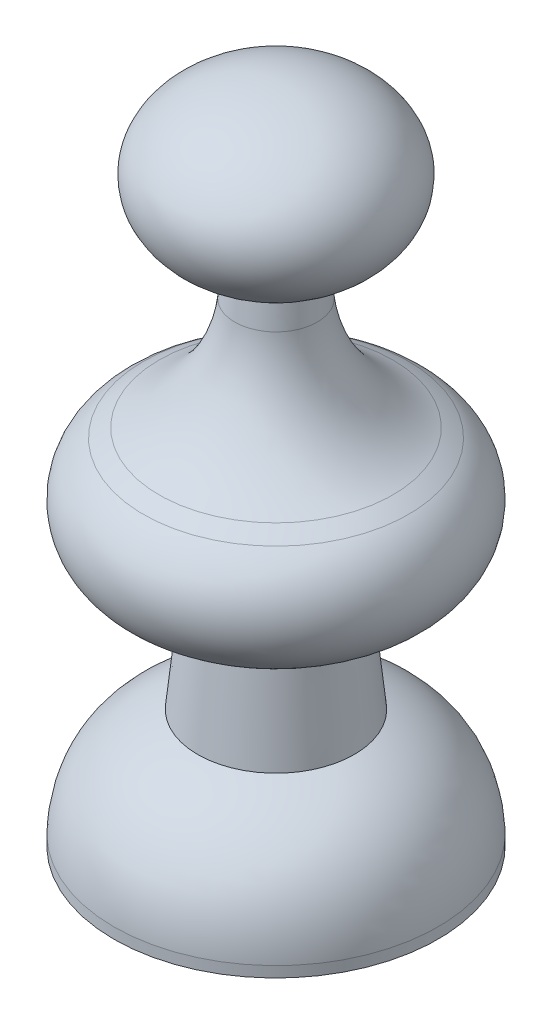
ISO-10303-21;
HEADER;
FILE_DESCRIPTION(('STEP AP214'),'2;1');
FILE_NAME('part.step','',(''),(''),'','','');
FILE_SCHEMA(('AUTOMOTIVE_DESIGN { 1 0 10303 214 1 1 1 1 }'));
ENDSEC;
DATA;
#1=APPLICATION_CONTEXT('core data for automotive mechanical design processes');
#2=APPLICATION_PROTOCOL_DEFINITION('international standard','automotive_design',2000,#1);
#3=PRODUCT_CONTEXT('',#1,'mechanical');
#4=PRODUCT('Part','Part','',(#3));
#5=PRODUCT_RELATED_PRODUCT_CATEGORY('part','',(#4));
#6=PRODUCT_DEFINITION_FORMATION('','',#4);
#7=PRODUCT_DEFINITION_CONTEXT('part definition',#1,'design');
#8=PRODUCT_DEFINITION('design','',#6,#7);
#9=PRODUCT_DEFINITION_SHAPE('','',#8);
#10=(LENGTH_UNIT() NAMED_UNIT(*) SI_UNIT(.MILLI.,.METRE.));
#11=(NAMED_UNIT(*) PLANE_ANGLE_UNIT() SI_UNIT($,.RADIAN.));
#12=(NAMED_UNIT(*) SI_UNIT($,.STERADIAN.) SOLID_ANGLE_UNIT());
#13=UNCERTAINTY_MEASURE_WITH_UNIT(LENGTH_MEASURE(1.E-05),#10,'distance_accuracy_value','');
#14=(GEOMETRIC_REPRESENTATION_CONTEXT(3) GLOBAL_UNCERTAINTY_ASSIGNED_CONTEXT((#13)) GLOBAL_UNIT_ASSIGNED_CONTEXT((#10,
#11,#12)) REPRESENTATION_CONTEXT('',''));
#15=CARTESIAN_POINT('',(0.,0.,0.));
#16=DIRECTION('',(0.,0.,1.));
#17=DIRECTION('',(1.,0.,0.));
#18=AXIS2_PLACEMENT_3D('',#15,#16,#17);
#19=CARTESIAN_POINT('',(0.,-0.762,0.));
#20=DIRECTION('',(0.,1.,0.));
#21=DIRECTION('',(0.,0.,1.));
#22=AXIS2_PLACEMENT_3D('',#19,#20,#21);
#23=CYLINDRICAL_SURFACE('',#22,11.5);
#24=CARTESIAN_POINT('',(0.,-0.762,0.));
#25=DIRECTION('',(0.,-1.,0.));
#26=DIRECTION('',(0.,0.,-1.));
#27=AXIS2_PLACEMENT_3D('',#24,#25,#26);
#28=CIRCLE('',#27,11.5);
#29=CARTESIAN_POINT('',(0.,-0.762,11.5));
#30=VERTEX_POINT('',#29);
#31=EDGE_CURVE('E11',#30,#30,#28,.T.);
#32=CARTESIAN_POINT('',(0.,0.,0.));
#33=DIRECTION('',(0.,-1.,0.));
#34=DIRECTION('',(0.,0.,-1.));
#35=AXIS2_PLACEMENT_3D('',#32,#33,#34);
#36=CIRCLE('',#35,11.5);
#37=CARTESIAN_POINT('',(0.,0.,11.5));
#38=VERTEX_POINT('',#37);
#39=EDGE_CURVE('E43',#38,#38,#36,.T.);
#40=CARTESIAN_POINT('',(0.,-0.762,11.5));
#41=CARTESIAN_POINT('',(0.,-0.7540625,11.5));
#42=CARTESIAN_POINT('',(0.,-0.746125,11.5));
#43=CARTESIAN_POINT('',(0.,-0.73025,11.5));
#44=CARTESIAN_POINT('',(0.,-0.7223125,11.5));
#45=CARTESIAN_POINT('',(0.,-0.7064375,11.5));
#46=CARTESIAN_POINT('',(0.,-0.6985,11.5));
#47=CARTESIAN_POINT('',(0.,-0.682625,11.5));
#48=CARTESIAN_POINT('',(0.,-0.6746875,11.5));
#49=CARTESIAN_POINT('',(0.,-0.6588125,11.5));
#50=CARTESIAN_POINT('',(0.,-0.650875,11.5));
#51=CARTESIAN_POINT('',(0.,-0.635,11.5));
#52=CARTESIAN_POINT('',(0.,-0.6270625,11.5));
#53=CARTESIAN_POINT('',(0.,-0.6111875,11.5));
#54=CARTESIAN_POINT('',(0.,-0.60325,11.5));
#55=CARTESIAN_POINT('',(0.,-0.587375,11.5));
#56=CARTESIAN_POINT('',(0.,-0.5794375,11.5));
#57=CARTESIAN_POINT('',(0.,-0.5635625,11.5));
#58=CARTESIAN_POINT('',(0.,-0.555625,11.5));
#59=CARTESIAN_POINT('',(0.,-0.53975,11.5));
#60=CARTESIAN_POINT('',(0.,-0.5318125,11.5));
#61=CARTESIAN_POINT('',(0.,-0.5159375,11.5));
#62=CARTESIAN_POINT('',(0.,-0.508,11.5));
#63=CARTESIAN_POINT('',(0.,-0.492125,11.5));
#64=CARTESIAN_POINT('',(0.,-0.4841875,11.5));
#65=CARTESIAN_POINT('',(0.,-0.4683125,11.5));
#66=CARTESIAN_POINT('',(0.,-0.460375,11.5));
#67=CARTESIAN_POINT('',(0.,-0.4445,11.5));
#68=CARTESIAN_POINT('',(0.,-0.4365625,11.5));
#69=CARTESIAN_POINT('',(0.,-0.4206875,11.5));
#70=CARTESIAN_POINT('',(0.,-0.41275,11.5));
#71=CARTESIAN_POINT('',(0.,-0.396875,11.5));
#72=CARTESIAN_POINT('',(0.,-0.3889375,11.5));
#73=CARTESIAN_POINT('',(0.,-0.3730625,11.5));
#74=CARTESIAN_POINT('',(0.,-0.365125,11.5));
#75=CARTESIAN_POINT('',(0.,-0.34925,11.5));
#76=CARTESIAN_POINT('',(0.,-0.3413125,11.5));
#77=CARTESIAN_POINT('',(0.,-0.3254375,11.5));
#78=CARTESIAN_POINT('',(0.,-0.3175,11.5));
#79=CARTESIAN_POINT('',(0.,-0.301625,11.5));
#80=CARTESIAN_POINT('',(0.,-0.2936875,11.5));
#81=CARTESIAN_POINT('',(0.,-0.2778125,11.5));
#82=CARTESIAN_POINT('',(0.,-0.269875,11.5));
#83=CARTESIAN_POINT('',(0.,-0.254,11.5));
#84=CARTESIAN_POINT('',(0.,-0.2460625,11.5));
#85=CARTESIAN_POINT('',(0.,-0.2301875,11.5));
#86=CARTESIAN_POINT('',(0.,-0.22225,11.5));
#87=CARTESIAN_POINT('',(0.,-0.206375,11.5));
#88=CARTESIAN_POINT('',(0.,-0.1984375,11.5));
#89=CARTESIAN_POINT('',(0.,-0.1825625,11.5));
#90=CARTESIAN_POINT('',(0.,-0.174625,11.5));
#91=CARTESIAN_POINT('',(0.,-0.15875,11.5));
#92=CARTESIAN_POINT('',(0.,-0.1508125,11.5));
#93=CARTESIAN_POINT('',(0.,-0.1349375,11.5));
#94=CARTESIAN_POINT('',(0.,-0.127,11.5));
#95=CARTESIAN_POINT('',(0.,-0.111125,11.5));
#96=CARTESIAN_POINT('',(0.,-0.1031875,11.5));
#97=CARTESIAN_POINT('',(0.,-0.0873125,11.5));
#98=CARTESIAN_POINT('',(0.,-0.079375,11.5));
#99=CARTESIAN_POINT('',(0.,-0.0635,11.5));
#100=CARTESIAN_POINT('',(0.,-0.0555625,11.5));
#101=CARTESIAN_POINT('',(0.,-0.0396875,11.5));
#102=CARTESIAN_POINT('',(0.,-0.03175,11.5));
#103=CARTESIAN_POINT('',(0.,-0.015875,11.5));
#104=CARTESIAN_POINT('',(0.,-0.00793749999999999,11.5));
#105=CARTESIAN_POINT('',(0.,0.,11.5));
#106=B_SPLINE_CURVE_WITH_KNOTS('',3,(#40,#41,#42,#43,#44,#45,#46,#47,#48,#49,#50,#51,#52,#53,
#54,#55,#56,#57,#58,#59,#60,#61,#62,#63,#64,#65,#66,#67,#68,#69,#70,#71,#72,#73,#74,#75,#76,#77,
#78,#79,#80,#81,#82,#83,#84,#85,#86,#87,#88,#89,#90,#91,#92,#93,#94,#95,#96,#97,#98,#99,#100,
#101,#102,#103,#104,#105),.UNSPECIFIED.,.F.,.F.,(4,2,2,2,2,2,2,2,2,2,2,2,2,2,2,2,2,2,2,2,2,2,2,
2,2,2,2,2,2,2,2,2,4),(0.,0.0238125000000001,0.047625,0.0714375,0.0952500000000001,0.1190625,
0.142875,0.1666875,0.1905,0.2143125,0.238125,0.2619375,0.28575,0.3095625,0.333375,0.3571875,
0.381,0.4048125,0.428625,0.4524375,0.47625,0.5000625,0.523875,0.5476875,0.5715,0.5953125,
0.619125,0.6429375,0.66675,0.6905625,0.714375,0.7381875,0.762),.UNSPECIFIED.);
#107=EDGE_CURVE('BSEAM40',#30,#38,#106,.T.);
#108=ORIENTED_EDGE('',*,*,#31,.F.);
#109=ORIENTED_EDGE('',*,*,#39,.T.);
#110=ORIENTED_EDGE('',*,*,#107,.T.);
#111=ORIENTED_EDGE('',*,*,#107,.F.);
#112=EDGE_LOOP('',(#108,#110,#109,#111));
#113=FACE_BOUND('',#112,.T.);
#114=ADVANCED_FACE('F40',(#113),#23,.T.);
#115=CARTESIAN_POINT('',(0.,-0.762,0.));
#116=DIRECTION('',(0.,-1.,0.));
#117=DIRECTION('',(0.,0.,-1.));
#118=AXIS2_PLACEMENT_3D('',#115,#116,#117);
#119=PLANE('',#118);
#120=ORIENTED_EDGE('',*,*,#31,.T.);
#121=EDGE_LOOP('',(#120));
#122=FACE_BOUND('',#121,.T.);
#123=ADVANCED_FACE('F55',(#122),#119,.T.);
#124=CARTESIAN_POINT('',(0.,0.,0.));
#125=DIRECTION('',(0.,-1.,0.));
#126=DIRECTION('',(0.,0.,-1.));
#127=AXIS2_PLACEMENT_3D('',#124,#125,#126);
#128=PLANE('',#127);
#129=ORIENTED_EDGE('',*,*,#39,.F.);
#130=EDGE_LOOP('',(#129));
#131=FACE_BOUND('',#130,.T.);
#132=ADVANCED_FACE('F53',(#131),#128,.F.);
#133=CLOSED_SHELL('',(#114,#123,#132));
#134=MANIFOLD_SOLID_BREP('B2',#133);
#135=CARTESIAN_POINT('',(0.,40.48125,0.));
#136=DIRECTION('',(0.,0.,1.));
#137=DIRECTION('',(-1.,0.,0.));
#138=AXIS2_PLACEMENT_3D('',#135,#136,#137);
#139=ELLIPSE('',#138,7.9375,5.55625);
#140=TRIMMED_CURVE('',#139,(PARAMETER_VALUE(4.71238898038469)),
(PARAMETER_VALUE(7.85398163397448)),.T.,.PARAMETER.);
#141=CARTESIAN_POINT('',(0.,46.0375,0.));
#142=DIRECTION('',(0.,1.,0.));
#143=AXIS1_PLACEMENT('',#141,#142);
#144=SURFACE_OF_REVOLUTION('',#140,#143);
#145=CARTESIAN_POINT('',(0.,35.2509756556801,0.));
#146=DIRECTION('',(0.,1.,0.));
#147=DIRECTION('',(0.,0.,1.));
#148=AXIS2_PLACEMENT_3D('',#145,#146,#147);
#149=CIRCLE('',#148,2.67876926722676);
#150=CARTESIAN_POINT('',(0.,35.2509756556801,2.67876926722676));
#151=VERTEX_POINT('',#150);
#152=EDGE_CURVE('E145',#151,#151,#149,.T.);
#153=ORIENTED_EDGE('',*,*,#152,.T.);
#154=EDGE_LOOP('',(#153));
#155=FACE_BOUND('',#154,.T.);
#156=CARTESIAN_POINT('',(0.,46.0375,0.));
#157=VERTEX_POINT('',#156);
#158=VERTEX_LOOP('',#157);
#159=FACE_BOUND('',#158,.T.);
#160=ADVANCED_FACE('F80',(#155,#159),#144,.F.);
#161=CARTESIAN_POINT('',(0.,35.2509756556801,0.));
#162=DIRECTION('',(0.,-1.,0.));
#163=DIRECTION('',(0.,0.,-1.));
#164=AXIS2_PLACEMENT_3D('',#161,#162,#163);
#165=CONICAL_SURFACE('',#164,2.67876926722676,0.103755465981785);
#166=CARTESIAN_POINT('',(0.,32.8711629756405,0.));
#167=DIRECTION('',(0.,-1.,0.));
#168=DIRECTION('',(0.,0.,-1.));
#169=AXIS2_PLACEMENT_3D('',#166,#167,#168);
#170=CIRCLE('',#169,2.92657771519888);
#171=CARTESIAN_POINT('',(0.,32.8711629756405,-2.92657771519888));
#172=VERTEX_POINT('',#171);
#173=EDGE_CURVE('E87',#172,#172,#170,.F.);
#174=ORIENTED_EDGE('',*,*,#173,.T.);
#175=EDGE_LOOP('',(#174));
#176=FACE_BOUND('',#175,.T.);
#177=ORIENTED_EDGE('',*,*,#152,.F.);
#178=EDGE_LOOP('',(#177));
#179=FACE_BOUND('',#178,.T.);
#180=ADVANCED_FACE('F91',(#176,#179),#165,.T.);
#181=CARTESIAN_POINT('',(0.,9.19742677821479,0.));
#182=DIRECTION('',(0.,1.,0.));
#183=DIRECTION('',(-1.,0.,0.));
#184=AXIS2_PLACEMENT_3D('',#181,#182,#183);
#185=SPHERICAL_SURFACE('',#184,17.7900732217852);
#186=CARTESIAN_POINT('',(0.,24.9353953916866,0.));
#187=DIRECTION('',(0.,-1.,0.));
#188=DIRECTION('',(0.,0.,-1.));
#189=AXIS2_PLACEMENT_3D('',#186,#187,#188);
#190=CIRCLE('',#189,8.29476034360576);
#191=CARTESIAN_POINT('',(-8.29476034360575,24.9353953916866,0.));
#192=VERTEX_POINT('',#191);
#193=EDGE_CURVE('E38',#192,#192,#190,.T.);
#194=CARTESIAN_POINT('',(0.,24.2949830228529,0.));
#195=DIRECTION('',(0.,1.,0.));
#196=DIRECTION('',(0.,0.,1.));
#197=AXIS2_PLACEMENT_3D('',#194,#195,#196);
#198=CIRCLE('',#197,9.41012755899025);
#199=CARTESIAN_POINT('',(-9.41012755899026,24.2949830228529,0.));
#200=VERTEX_POINT('',#199);
#201=EDGE_CURVE('E143',#200,#200,#198,.T.);
#202=CARTESIAN_POINT('',(-8.29476034360575,24.9353953916866,0.));
#203=CARTESIAN_POINT('',(-8.30661488255874,24.9291474087658,0.));
#204=CARTESIAN_POINT('',(-8.31846236209764,24.9228860317467,0.));
#205=CARTESIAN_POINT('',(-8.34214314190646,24.9103365215927,0.));
#206=CARTESIAN_POINT('',(-8.35397644217639,24.9040483884579,0.));
#207=CARTESIAN_POINT('',(-8.37762880300648,24.8914453981531,0.));
#208=CARTESIAN_POINT('',(-8.38944786356665,24.8851305409832,0.));
#209=CARTESIAN_POINT('',(-8.41307168462854,24.8724741348624,0.));
#210=CARTESIAN_POINT('',(-8.42487644513026,24.8661325859115,0.));
#211=CARTESIAN_POINT('',(-8.44847160579441,24.8534228286088,0.));
#212=CARTESIAN_POINT('',(-8.46026200595684,24.8470546202572,0.));
#213=CARTESIAN_POINT('',(-8.48382838573627,24.8342915766722,0.));
#214=CARTESIAN_POINT('',(-8.49560436535327,24.827896741439,0.));
#215=CARTESIAN_POINT('',(-8.51914184390897,24.8150804767453,0.));
#216=CARTESIAN_POINT('',(-8.53090334284767,24.8086590472848,0.));
#217=CARTESIAN_POINT('',(-8.55441179998795,24.7957896269272,0.));
#218=CARTESIAN_POINT('',(-8.56615875818953,24.7893416360299,0.));
#219=CARTESIAN_POINT('',(-8.58963807387097,24.7764191257246,0.));
#220=CARTESIAN_POINT('',(-8.60137043135082,24.7699446063166,0.));
#221=CARTESIAN_POINT('',(-8.62482048567877,24.756969072051,0.));
#222=CARTESIAN_POINT('',(-8.63653818252686,24.7504680571936,0.));
#223=CARTESIAN_POINT('',(-8.65995885575611,24.7374395652261,0.));
#224=CARTESIAN_POINT('',(-8.67166183213727,24.730912088116,0.));
#225=CARTESIAN_POINT('',(-8.69505300467264,24.7178307049751,0.));
#226=CARTESIAN_POINT('',(-8.70674120082685,24.7112767989443,0.));
#227=CARTESIAN_POINT('',(-8.73010275322381,24.6981425914286,0.));
#228=CARTESIAN_POINT('',(-8.74177610946654,24.6915622899438,0.));
#229=CARTESIAN_POINT('',(-8.76510792243179,24.678375325122,0.));
#230=CARTESIAN_POINT('',(-8.77676637915429,24.6717686617848,0.));
#231=CARTESIAN_POINT('',(-8.80006833354641,24.6585290069945,0.));
#232=CARTESIAN_POINT('',(-8.81171183121601,24.6518960155413,0.));
#233=CARTESIAN_POINT('',(-8.83498380804603,24.6386037383894,0.));
#234=CARTESIAN_POINT('',(-8.84661228720644,24.6319444526908,0.));
#235=CARTESIAN_POINT('',(-8.86985416763849,24.618599621053,0.));
#236=CARTESIAN_POINT('',(-8.88146756891012,24.6119140751138,0.));
#237=CARTESIAN_POINT('',(-8.90467923426201,24.598516757134,0.));
#238=CARTESIAN_POINT('',(-8.91627749834225,24.5918049850934,0.));
#239=CARTESIAN_POINT('',(-8.93945883008606,24.5783552491836,0.));
#240=CARTESIAN_POINT('',(-8.95104189774962,24.5716172853145,0.));
#241=CARTESIAN_POINT('',(-8.97419277751234,24.5581152001544,0.));
#242=CARTESIAN_POINT('',(-8.98576058961151,24.5513510788634,0.));
#243=CARTESIAN_POINT('',(-9.00888089917564,24.5377967133999,0.));
#244=CARTESIAN_POINT('',(-9.0204333966406,24.5310064692274,0.));
#245=CARTESIAN_POINT('',(-9.04352301794473,24.5173998926745,0.));
#246=CARTESIAN_POINT('',(-9.0550601417839,24.510583560294,0.));
#247=CARTESIAN_POINT('',(-9.07811895692333,24.4969248421322,0.));
#248=CARTESIAN_POINT('',(-9.08964064822359,24.4900824563508,0.));
#249=CARTESIAN_POINT('',(-9.11266853945093,24.4763716663268,0.));
#250=CARTESIAN_POINT('',(-9.124174739378,24.4695032620843,0.));
#251=CARTESIAN_POINT('',(-9.14717158910376,24.4557404702109,0.));
#252=CARTESIAN_POINT('',(-9.15866223890245,24.4488460825801,0.));
#253=CARTESIAN_POINT('',(-9.18162792969566,24.4350313591355,0.));
#254=CARTESIAN_POINT('',(-9.19310297069019,24.4281110233218,0.));
#255=CARTESIAN_POINT('',(-9.21603738527898,24.4142444388495,0.));
#256=CARTESIAN_POINT('',(-9.22749675887324,24.4072981901908,0.));
#257=CARTESIAN_POINT('',(-9.25039978014551,24.393379815499,0.));
#258=CARTESIAN_POINT('',(-9.26184342782352,24.3864076894659,0.));
#259=CARTESIAN_POINT('',(-9.2847149388272,24.372437595627,0.));
#260=CARTESIAN_POINT('',(-9.29614280215285,24.3654396278212,0.));
#261=CARTESIAN_POINT('',(-9.31898268609788,24.3514178861735,0.));
#262=CARTESIAN_POINT('',(-9.33039470671725,24.3443941123314,0.));
#263=CARTESIAN_POINT('',(-9.35320284697082,24.3303207944699,0.));
#264=CARTESIAN_POINT('',(-9.36459896660501,24.3232712504504,0.));
#265=CARTESIAN_POINT('',(-9.38737524671237,24.3091464282593,0.));
#266=CARTESIAN_POINT('',(-9.39875540718554,24.3020711500877,0.));
#267=CARTESIAN_POINT('',(-9.41012755899026,24.2949830228529,0.));
#268=B_SPLINE_CURVE_WITH_KNOTS('',3,(#202,#203,#204,#205,#206,#207,#208,#209,#210,#211,#212,
#213,#214,#215,#216,#217,#218,#219,#220,#221,#222,#223,#224,#225,#226,#227,#228,#229,#230,#231,
#232,#233,#234,#235,#236,#237,#238,#239,#240,#241,#242,#243,#244,#245,#246,#247,#248,#249,#250,
#251,#252,#253,#254,#255,#256,#257,#258,#259,#260,#261,#262,#263,#264,#265,#266,#267),
.UNSPECIFIED.,.F.,.F.,(4,2,2,2,2,2,2,2,2,2,2,2,2,2,2,2,2,2,2,2,2,2,2,2,2,2,2,2,2,2,2,2,4),(0.,
0.0402008180461157,0.0804016360922294,0.120602454138343,0.160803272184455,0.201004090230573,
0.241204908276682,0.2814057263228,0.321606544368912,0.361807362415027,0.402008180461143,
0.442208998507255,0.48240981655337,0.522610634599481,0.562811452645599,0.60301227069171,
0.643213088737826,0.683413906783942,0.723614724830053,0.763815542876169,0.804016360922283,
0.844217178968397,0.88441799701451,0.924618815060625,0.964819633106741,1.00502045115285,
1.04522126919897,1.08542208724508,1.1256229052912,1.16582372333731,1.20602454138343,
1.24622535942954,1.28642617747565),.UNSPECIFIED.);
#269=EDGE_CURVE('BSEAM96',#192,#200,#268,.T.);
#270=ORIENTED_EDGE('',*,*,#193,.T.);
#271=ORIENTED_EDGE('',*,*,#201,.T.);
#272=ORIENTED_EDGE('',*,*,#269,.T.);
#273=ORIENTED_EDGE('',*,*,#269,.F.);
#274=EDGE_LOOP('',(#270,#272,#271,#273));
#275=FACE_BOUND('',#274,.T.);
#276=ADVANCED_FACE('F96',(#275),#185,.T.);
#277=CARTESIAN_POINT('',(0.,20.5298074487024,0.));
#278=DIRECTION('',(0.,1.,0.));
#279=DIRECTION('',(0.,0.,1.));
#280=AXIS2_PLACEMENT_3D('',#277,#278,#279);
#281=TOROIDAL_SURFACE('',#280,7.06333832630674,4.43666167369326);
#282=CARTESIAN_POINT('',(0.,16.3990213109783,0.));
#283=DIRECTION('',(0.,1.,0.));
#284=DIRECTION('',(0.,0.,1.));
#285=AXIS2_PLACEMENT_3D('',#282,#283,#284);
#286=CIRCLE('',#285,8.68215662716853);
#287=CARTESIAN_POINT('',(-8.68215662716852,16.3990213109783,0.));
#288=VERTEX_POINT('',#287);
#289=EDGE_CURVE('E146',#288,#288,#286,.T.);
#290=ORIENTED_EDGE('',*,*,#289,.T.);
#291=EDGE_LOOP('',(#290));
#292=FACE_BOUND('',#291,.T.);
#293=ORIENTED_EDGE('',*,*,#201,.F.);
#294=EDGE_LOOP('',(#293));
#295=FACE_BOUND('',#294,.T.);
#296=ADVANCED_FACE('F131',(#292,#295),#281,.T.);
#297=CARTESIAN_POINT('',(0.,38.5535350213588,0.));
#298=DIRECTION('',(0.,1.,0.));
#299=DIRECTION('',(-1.,0.,0.));
#300=AXIS2_PLACEMENT_3D('',#297,#298,#299);
#301=SPHERICAL_SURFACE('',#300,23.7950062290835);
#302=CARTESIAN_POINT('',(0.,15.5355633437393,0.));
#303=DIRECTION('',(0.,1.,0.));
#304=DIRECTION('',(0.,0.,1.));
#305=AXIS2_PLACEMENT_3D('',#302,#303,#304);
#306=CIRCLE('',#305,6.03119401863606);
#307=CARTESIAN_POINT('',(-6.03119401863603,15.5355633437393,0.));
#308=VERTEX_POINT('',#307);
#309=EDGE_CURVE('E150',#308,#308,#306,.T.);
#310=CARTESIAN_POINT('',(-6.03119401863603,15.5355633437393,0.));
#311=CARTESIAN_POINT('',(-6.05930380907633,15.5429287013928,0.));
#312=CARTESIAN_POINT('',(-6.08740010740792,15.5503455514932,0.));
#313=CARTESIAN_POINT('',(-6.14356534302966,15.5652821359482,0.));
#314=CARTESIAN_POINT('',(-6.17163428031981,15.5728018703029,0.));
#315=CARTESIAN_POINT('',(-6.22774441703467,15.5879441226272,0.));
#316=CARTESIAN_POINT('',(-6.25578561645938,15.5955666405968,0.));
#317=CARTESIAN_POINT('',(-6.31183990109007,15.6109143577618,0.));
#318=CARTESIAN_POINT('',(-6.33985298629604,15.6186395569573,0.));
#319=CARTESIAN_POINT('',(-6.39585066648694,15.634192532906,0.));
#320=CARTESIAN_POINT('',(-6.42383526147187,15.6420203096593,0.));
#321=CARTESIAN_POINT('',(-6.47977558560783,15.6577783356522,0.));
#322=CARTESIAN_POINT('',(-6.50773131475887,15.6657085848918,0.));
#323=CARTESIAN_POINT('',(-6.56361353199975,15.6816714494176,0.));
#324=CARTESIAN_POINT('',(-6.5915400200896,15.6897040647038,0.));
#325=CARTESIAN_POINT('',(-6.64736338037381,15.7058715535072,0.));
#326=CARTESIAN_POINT('',(-6.67526025256817,15.7140064270244,0.));
#327=CARTESIAN_POINT('',(-6.73102400662445,15.7303783231021,0.));
#328=CARTESIAN_POINT('',(-6.75889088848638,15.7386153456626,0.));
#329=CARTESIAN_POINT('',(-6.81459428784345,15.755191429268,0.));
#330=CARTESIAN_POINT('',(-6.84243080533859,15.763530490313,0.));
#331=CARTESIAN_POINT('',(-6.89807310233526,15.780310538959,0.));
#332=CARTESIAN_POINT('',(-6.92587888183679,15.78875152656,0.));
#333=CARTESIAN_POINT('',(-6.981459329632,15.8057353150217,0.));
#334=CARTESIAN_POINT('',(-7.00923399792569,15.8142781158824,0.));
#335=CARTESIAN_POINT('',(-7.06475185050854,15.8314654162002,0.));
#336=CARTESIAN_POINT('',(-7.09249503479771,15.8401099156574,0.));
#337=CARTESIAN_POINT('',(-7.14794954699747,15.8575004971404,0.));
#338=CARTESIAN_POINT('',(-7.17566087490805,15.8662465791661,0.));
#339=CARTESIAN_POINT('',(-7.23105130240413,15.8838402083946,0.));
#340=CARTESIAN_POINT('',(-7.25873040198963,15.8926877555974,0.));
#341=CARTESIAN_POINT('',(-7.31405600132161,15.9104841964265,0.));
#342=CARTESIAN_POINT('',(-7.34170250106809,15.9194330900529,0.));
#343=CARTESIAN_POINT('',(-7.3969625296457,15.9374321036156,0.));
#344=CARTESIAN_POINT('',(-7.42457605847682,15.9464822235519,0.));
#345=CARTESIAN_POINT('',(-7.47976977458986,15.9646835682621,0.));
#346=CARTESIAN_POINT('',(-7.50734996187179,15.973834793036,0.));
#347=CARTESIAN_POINT('',(-7.56247662470016,15.992238224592,0.));
#348=CARTESIAN_POINT('',(-7.59002310024659,16.0014904313741,0.));
#349=CARTESIAN_POINT('',(-7.64508196987016,16.0200957027616,0.));
#350=CARTESIAN_POINT('',(-7.67259436394729,16.0294487673671,0.));
#351=CARTESIAN_POINT('',(-7.72758470135586,16.0482556288628,0.));
#352=CARTESIAN_POINT('',(-7.75506264468731,16.0577094257531,0.));
#353=CARTESIAN_POINT('',(-7.80998371179056,16.0767176249278,0.));
#354=CARTESIAN_POINT('',(-7.83742683556236,16.0862720272124,0.));
#355=CARTESIAN_POINT('',(-7.8922778951997,16.1054813089347,0.));
#356=CARTESIAN_POINT('',(-7.91968583106524,16.1151361883725,0.));
#357=CARTESIAN_POINT('',(-7.97446614701576,16.1345462948119,0.));
#358=CARTESIAN_POINT('',(-8.00183852710073,16.1443015218135,0.));
#359=CARTESIAN_POINT('',(-8.05654736409303,16.1639121924441,0.));
#360=CARTESIAN_POINT('',(-8.08388382100035,16.173767636073,0.));
#361=CARTESIAN_POINT('',(-8.13852044472246,16.1935786076765,0.));
#362=CARTESIAN_POINT('',(-8.16582061153725,16.2035341356511,0.));
#363=CARTESIAN_POINT('',(-8.22038428864634,16.2235451423215,0.));
#364=CARTESIAN_POINT('',(-8.24764779894064,16.2336006210173,0.));
#365=CARTESIAN_POINT('',(-8.3021377970735,16.2538113941621,0.));
#366=CARTESIAN_POINT('',(-8.32936428491207,16.2639666886111,0.));
#367=CARTESIAN_POINT('',(-8.38377987269247,16.2843769569616,0.));
#368=CARTESIAN_POINT('',(-8.41096897263431,16.294631930863,0.));
#369=CARTESIAN_POINT('',(-8.46530941969205,16.315241420454,0.));
#370=CARTESIAN_POINT('',(-8.49246076680795,16.3255959361436,0.));
#371=CARTESIAN_POINT('',(-8.54672534375422,16.346404370406,0.));
#372=CARTESIAN_POINT('',(-8.5738385735846,16.3568582889789,0.));
#373=CARTESIAN_POINT('',(-8.62802655215027,16.377865388412,0.));
#374=CARTESIAN_POINT('',(-8.65510130088555,16.3884185692723,0.));
#375=CARTESIAN_POINT('',(-8.68215662716852,16.3990213109783,0.));
#376=B_SPLINE_CURVE_WITH_KNOTS('',3,(#310,#311,#312,#313,#314,#315,#316,#317,#318,#319,#320,
#321,#322,#323,#324,#325,#326,#327,#328,#329,#330,#331,#332,#333,#334,#335,#336,#337,#338,#339,
#340,#341,#342,#343,#344,#345,#346,#347,#348,#349,#350,#351,#352,#353,#354,#355,#356,#357,#358,
#359,#360,#361,#362,#363,#364,#365,#366,#367,#368,#369,#370,#371,#372,#373,#374,#375),
.UNSPECIFIED.,.F.,.F.,(4,2,2,2,2,2,2,2,2,2,2,2,2,2,2,2,2,2,2,2,2,2,2,2,2,2,2,2,2,2,2,2,4),(0.,
0.0871760907979682,0.174352181595935,0.261528272393907,0.348704363191874,0.435880453989841,
0.523056544787809,0.610232635585777,0.697408726383748,0.784584817181715,0.871760907979681,
0.958936998777649,1.04611308957562,1.13328918037358,1.22046527117156,1.30764136196952,
1.39481745276749,1.48199354356546,1.56916963436342,1.6563457251614,1.74352181595936,
1.83069790675733,1.9178739975553,2.00505008835326,2.09222617915123,2.1794022699492,
2.26657836074717,2.35375445154514,2.4409305423431,2.52810663314107,2.61528272393905,
2.70245881473701,2.78963490553498),.UNSPECIFIED.);
#377=EDGE_CURVE('BSEAM127',#308,#288,#376,.T.);
#378=ORIENTED_EDGE('',*,*,#309,.T.);
#379=ORIENTED_EDGE('',*,*,#289,.F.);
#380=ORIENTED_EDGE('',*,*,#377,.T.);
#381=ORIENTED_EDGE('',*,*,#377,.F.);
#382=EDGE_LOOP('',(#378,#380,#379,#381));
#383=FACE_BOUND('',#382,.T.);
#384=ADVANCED_FACE('F127',(#383),#301,.T.);
#385=CARTESIAN_POINT('',(0.,14.0613301160205,0.));
#386=DIRECTION('',(0.,1.,0.));
#387=DIRECTION('',(0.,0.,1.));
#388=AXIS2_PLACEMENT_3D('',#385,#386,#387);
#389=TOROIDAL_SURFACE('',#388,6.41747421524164,1.524);
#390=CARTESIAN_POINT('',(0.,13.903490337989,0.));
#391=DIRECTION('',(0.,1.,0.));
#392=DIRECTION('',(0.,0.,1.));
#393=AXIS2_PLACEMENT_3D('',#390,#391,#392);
#394=CIRCLE('',#393,4.90166993880257);
#395=CARTESIAN_POINT('',(0.,13.903490337989,4.90166993880257));
#396=VERTEX_POINT('',#395);
#397=EDGE_CURVE('E169',#396,#396,#394,.T.);
#398=ORIENTED_EDGE('',*,*,#397,.T.);
#399=EDGE_LOOP('',(#398));
#400=FACE_BOUND('',#399,.T.);
#401=ORIENTED_EDGE('',*,*,#309,.F.);
#402=EDGE_LOOP('',(#401));
#403=FACE_BOUND('',#402,.T.);
#404=ADVANCED_FACE('F123',(#400,#403),#389,.F.);
#405=CARTESIAN_POINT('',(0.,13.903490337989,0.));
#406=DIRECTION('',(0.,-1.,0.));
#407=DIRECTION('',(0.,0.,-1.));
#408=AXIS2_PLACEMENT_3D('',#405,#406,#407);
#409=CONICAL_SURFACE('',#408,4.90166993880257,0.103755465981784);
#410=CARTESIAN_POINT('',(0.,7.61727232368625,0.));
#411=DIRECTION('',(0.,1.,0.));
#412=DIRECTION('',(0.,0.,1.));
#413=AXIS2_PLACEMENT_3D('',#410,#411,#412);
#414=CIRCLE('',#413,5.55625);
#415=CARTESIAN_POINT('',(0.,7.61727232368625,5.55625));
#416=VERTEX_POINT('',#415);
#417=EDGE_CURVE('E167',#416,#416,#414,.T.);
#418=ORIENTED_EDGE('',*,*,#417,.T.);
#419=EDGE_LOOP('',(#418));
#420=FACE_BOUND('',#419,.T.);
#421=ORIENTED_EDGE('',*,*,#397,.F.);
#422=EDGE_LOOP('',(#421));
#423=FACE_BOUND('',#422,.T.);
#424=ADVANCED_FACE('F119',(#420,#423),#409,.T.);
#425=CARTESIAN_POINT('',(-5.55625,7.61727232368625,0.));
#426=CARTESIAN_POINT('',(-11.2207392934526,5.54480325649878,0.));
#427=CARTESIAN_POINT('',(-11.5,0.,0.));
#428=B_SPLINE_CURVE_WITH_KNOTS('',2,(#425,#426,#427),.UNSPECIFIED.,.F.,.F.,(3,3),(0.,1.),.UNSPECIFIED.);
#429=CARTESIAN_POINT('',(0.,46.0375,0.));
#430=DIRECTION('',(0.,1.,0.));
#431=AXIS1_PLACEMENT('',#429,#430);
#432=SURFACE_OF_REVOLUTION('',#428,#431);
#433=CARTESIAN_POINT('',(0.,0.,0.));
#434=DIRECTION('',(0.,1.,0.));
#435=DIRECTION('',(0.,0.,1.));
#436=AXIS2_PLACEMENT_3D('',#433,#434,#435);
#437=CIRCLE('',#436,11.5);
#438=CARTESIAN_POINT('',(0.,0.,11.5));
#439=VERTEX_POINT('',#438);
#440=EDGE_CURVE('E108',#439,#439,#437,.T.);
#441=ORIENTED_EDGE('',*,*,#440,.T.);
#442=EDGE_LOOP('',(#441));
#443=FACE_BOUND('',#442,.T.);
#444=ORIENTED_EDGE('',*,*,#417,.F.);
#445=EDGE_LOOP('',(#444));
#446=FACE_BOUND('',#445,.T.);
#447=ADVANCED_FACE('F114',(#443,#446),#432,.F.);
#448=CARTESIAN_POINT('',(0.,0.,0.));
#449=DIRECTION('',(0.,-1.,0.));
#450=DIRECTION('',(0.,0.,-1.));
#451=AXIS2_PLACEMENT_3D('',#448,#449,#450);
#452=PLANE('',#451);
#453=ORIENTED_EDGE('',*,*,#440,.F.);
#454=EDGE_LOOP('',(#453));
#455=FACE_BOUND('',#454,.T.);
#456=ADVANCED_FACE('F118',(#455),#452,.T.);
#457=CARTESIAN_POINT('',(0.,33.9234281625168,0.));
#458=DIRECTION('',(0.,-1.,0.));
#459=DIRECTION('',(0.,0.,-1.));
#460=AXIS2_PLACEMENT_3D('',#457,#458,#459);
#461=TOROIDAL_SURFACE('',#460,13.031939558126,10.16);
#462=ORIENTED_EDGE('',*,*,#193,.F.);
#463=EDGE_LOOP('',(#462));
#464=FACE_BOUND('',#463,.T.);
#465=ORIENTED_EDGE('',*,*,#173,.F.);
#466=EDGE_LOOP('',(#465));
#467=FACE_BOUND('',#466,.T.);
#468=ADVANCED_FACE('F82',(#464,#467),#461,.F.);
#469=CLOSED_SHELL('',(#160,#180,#276,#296,#384,#404,#424,#447,#456,#468));
#470=MANIFOLD_SOLID_BREP('B6',#469);
#471=ADVANCED_BREP_SHAPE_REPRESENTATION('',(#18,#134,#470),#14);
#472=SHAPE_DEFINITION_REPRESENTATION(#9,#471);
ENDSEC;
END-ISO-10303-21;
